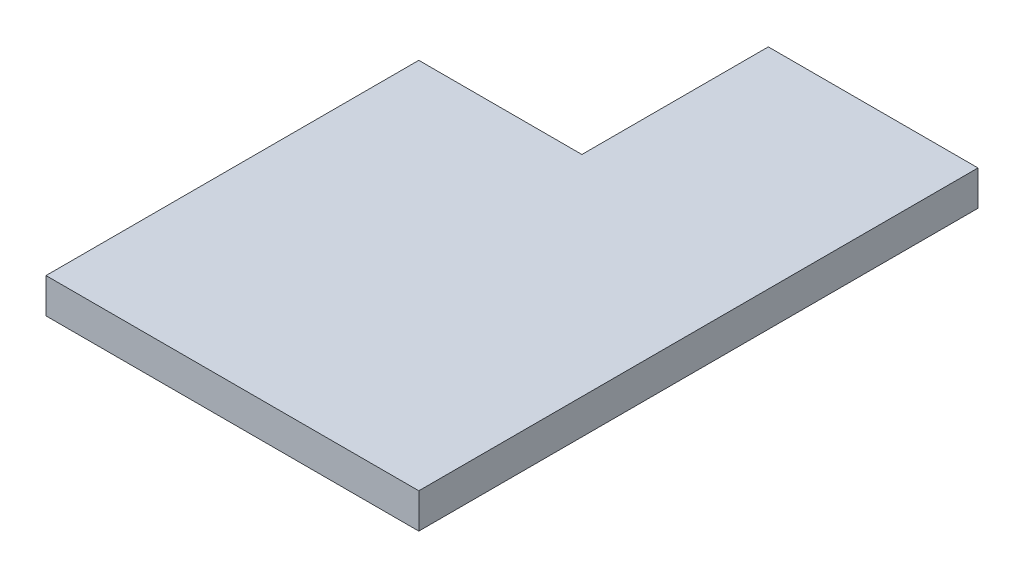
ISO-10303-21;
HEADER;
FILE_DESCRIPTION(('STEP AP214'),'2;1');
FILE_NAME('part.step','',(''),(''),'','','');
FILE_SCHEMA(('AUTOMOTIVE_DESIGN { 1 0 10303 214 1 1 1 1 }'));
ENDSEC;
DATA;
#1=APPLICATION_CONTEXT('core data for automotive mechanical design processes');
#2=APPLICATION_PROTOCOL_DEFINITION('international standard','automotive_design',2000,#1);
#3=PRODUCT_CONTEXT('',#1,'mechanical');
#4=PRODUCT('Part','Part','',(#3));
#5=PRODUCT_RELATED_PRODUCT_CATEGORY('part','',(#4));
#6=PRODUCT_DEFINITION_FORMATION('','',#4);
#7=PRODUCT_DEFINITION_CONTEXT('part definition',#1,'design');
#8=PRODUCT_DEFINITION('design','',#6,#7);
#9=PRODUCT_DEFINITION_SHAPE('','',#8);
#10=(LENGTH_UNIT() NAMED_UNIT(*) SI_UNIT(.MILLI.,.METRE.));
#11=(NAMED_UNIT(*) PLANE_ANGLE_UNIT() SI_UNIT($,.RADIAN.));
#12=(NAMED_UNIT(*) SI_UNIT($,.STERADIAN.) SOLID_ANGLE_UNIT());
#13=UNCERTAINTY_MEASURE_WITH_UNIT(LENGTH_MEASURE(1.E-05),#10,'distance_accuracy_value','');
#14=(GEOMETRIC_REPRESENTATION_CONTEXT(3) GLOBAL_UNCERTAINTY_ASSIGNED_CONTEXT((#13)) GLOBAL_UNIT_ASSIGNED_CONTEXT((#10,
#11,#12)) REPRESENTATION_CONTEXT('',''));
#15=CARTESIAN_POINT('',(0.,0.,0.));
#16=DIRECTION('',(0.,0.,1.));
#17=DIRECTION('',(1.,0.,0.));
#18=AXIS2_PLACEMENT_3D('',#15,#16,#17);
#19=CARTESIAN_POINT('',(0.,19.05,-203.2));
#20=DIRECTION('',(1.,0.,0.));
#21=DIRECTION('',(0.,0.,-1.));
#22=AXIS2_PLACEMENT_3D('',#19,#20,#21);
#23=PLANE('',#22);
#24=DIRECTION('',(0.,0.,1.));
#25=VECTOR('',#24,1.);
#26=CARTESIAN_POINT('',(0.,0.,-203.2));
#27=LINE('',#26,#25);
#28=CARTESIAN_POINT('',(0.,0.,-203.2));
#29=VERTEX_POINT('',#28);
#30=CARTESIAN_POINT('',(0.,0.,0.));
#31=VERTEX_POINT('',#30);
#32=EDGE_CURVE('E121',#29,#31,#27,.T.);
#33=ORIENTED_EDGE('',*,*,#32,.T.);
#34=DIRECTION('',(0.,-1.,0.));
#35=VECTOR('',#34,1.);
#36=CARTESIAN_POINT('',(0.,19.05,0.));
#37=LINE('',#36,#35);
#38=CARTESIAN_POINT('',(0.,19.05,0.));
#39=VERTEX_POINT('',#38);
#40=EDGE_CURVE('E11',#39,#31,#37,.T.);
#41=ORIENTED_EDGE('',*,*,#40,.F.);
#42=DIRECTION('',(0.,0.,1.));
#43=VECTOR('',#42,1.);
#44=CARTESIAN_POINT('',(0.,19.05,-203.2));
#45=LINE('',#44,#43);
#46=CARTESIAN_POINT('',(0.,19.05,-203.2));
#47=VERTEX_POINT('',#46);
#48=EDGE_CURVE('E133',#47,#39,#45,.T.);
#49=ORIENTED_EDGE('',*,*,#48,.F.);
#50=DIRECTION('',(0.,-1.,0.));
#51=VECTOR('',#50,1.);
#52=CARTESIAN_POINT('',(0.,19.05,-203.2));
#53=LINE('',#52,#51);
#54=EDGE_CURVE('E118',#47,#29,#53,.T.);
#55=ORIENTED_EDGE('',*,*,#54,.T.);
#56=EDGE_LOOP('',(#33,#41,#49,#55));
#57=FACE_BOUND('',#56,.T.);
#58=ADVANCED_FACE('F39',(#57),#23,.F.);
#59=CARTESIAN_POINT('',(0.,19.05,0.));
#60=DIRECTION('',(0.,0.,-1.));
#61=DIRECTION('',(-1.,0.,0.));
#62=AXIS2_PLACEMENT_3D('',#59,#60,#61);
#63=PLANE('',#62);
#64=DIRECTION('',(1.,0.,0.));
#65=VECTOR('',#64,1.);
#66=CARTESIAN_POINT('',(0.,0.,0.));
#67=LINE('',#66,#65);
#68=CARTESIAN_POINT('',(203.2,0.,0.));
#69=VERTEX_POINT('',#68);
#70=EDGE_CURVE('E128',#31,#69,#67,.T.);
#71=ORIENTED_EDGE('',*,*,#70,.T.);
#72=DIRECTION('',(0.,-1.,0.));
#73=VECTOR('',#72,1.);
#74=CARTESIAN_POINT('',(203.2,19.05,0.));
#75=LINE('',#74,#73);
#76=CARTESIAN_POINT('',(203.2,19.05,0.));
#77=VERTEX_POINT('',#76);
#78=EDGE_CURVE('E50',#77,#69,#75,.T.);
#79=ORIENTED_EDGE('',*,*,#78,.F.);
#80=DIRECTION('',(1.,0.,0.));
#81=VECTOR('',#80,1.);
#82=CARTESIAN_POINT('',(0.,19.05,0.));
#83=LINE('',#82,#81);
#84=EDGE_CURVE('E95',#39,#77,#83,.T.);
#85=ORIENTED_EDGE('',*,*,#84,.F.);
#86=ORIENTED_EDGE('',*,*,#40,.T.);
#87=EDGE_LOOP('',(#71,#79,#85,#86));
#88=FACE_BOUND('',#87,.T.);
#89=ADVANCED_FACE('F160',(#88),#63,.F.);
#90=CARTESIAN_POINT('',(203.2,19.05,0.));
#91=DIRECTION('',(-1.,0.,0.));
#92=DIRECTION('',(0.,0.,1.));
#93=AXIS2_PLACEMENT_3D('',#90,#91,#92);
#94=PLANE('',#93);
#95=DIRECTION('',(0.,0.,-1.));
#96=VECTOR('',#95,1.);
#97=CARTESIAN_POINT('',(203.2,0.,0.));
#98=LINE('',#97,#96);
#99=CARTESIAN_POINT('',(203.2,0.,-304.8));
#100=VERTEX_POINT('',#99);
#101=EDGE_CURVE('E126',#69,#100,#98,.T.);
#102=ORIENTED_EDGE('',*,*,#101,.T.);
#103=DIRECTION('',(0.,-1.,0.));
#104=VECTOR('',#103,1.);
#105=CARTESIAN_POINT('',(203.2,19.05,-304.8));
#106=LINE('',#105,#104);
#107=CARTESIAN_POINT('',(203.2,19.05,-304.8));
#108=VERTEX_POINT('',#107);
#109=EDGE_CURVE('E114',#108,#100,#106,.T.);
#110=ORIENTED_EDGE('',*,*,#109,.F.);
#111=DIRECTION('',(0.,0.,-1.));
#112=VECTOR('',#111,1.);
#113=CARTESIAN_POINT('',(203.2,19.05,0.));
#114=LINE('',#113,#112);
#115=EDGE_CURVE('E103',#77,#108,#114,.T.);
#116=ORIENTED_EDGE('',*,*,#115,.F.);
#117=ORIENTED_EDGE('',*,*,#78,.T.);
#118=EDGE_LOOP('',(#102,#110,#116,#117));
#119=FACE_BOUND('',#118,.T.);
#120=ADVANCED_FACE('F137',(#119),#94,.F.);
#121=CARTESIAN_POINT('',(203.2,19.05,-304.8));
#122=DIRECTION('',(0.,0.,1.));
#123=DIRECTION('',(1.,0.,0.));
#124=AXIS2_PLACEMENT_3D('',#121,#122,#123);
#125=PLANE('',#124);
#126=DIRECTION('',(-1.,0.,0.));
#127=VECTOR('',#126,1.);
#128=CARTESIAN_POINT('',(203.2,0.,-304.8));
#129=LINE('',#128,#127);
#130=CARTESIAN_POINT('',(88.9,0.,-304.8));
#131=VERTEX_POINT('',#130);
#132=EDGE_CURVE('E111',#100,#131,#129,.T.);
#133=ORIENTED_EDGE('',*,*,#132,.T.);
#134=DIRECTION('',(0.,-1.,0.));
#135=VECTOR('',#134,1.);
#136=CARTESIAN_POINT('',(88.9,19.05,-304.8));
#137=LINE('',#136,#135);
#138=CARTESIAN_POINT('',(88.9,19.05,-304.8));
#139=VERTEX_POINT('',#138);
#140=EDGE_CURVE('E110',#139,#131,#137,.T.);
#141=ORIENTED_EDGE('',*,*,#140,.F.);
#142=DIRECTION('',(-1.,0.,0.));
#143=VECTOR('',#142,1.);
#144=CARTESIAN_POINT('',(203.2,19.05,-304.8));
#145=LINE('',#144,#143);
#146=EDGE_CURVE('E98',#108,#139,#145,.T.);
#147=ORIENTED_EDGE('',*,*,#146,.F.);
#148=ORIENTED_EDGE('',*,*,#109,.T.);
#149=EDGE_LOOP('',(#133,#141,#147,#148));
#150=FACE_BOUND('',#149,.T.);
#151=ADVANCED_FACE('F112',(#150),#125,.F.);
#152=CARTESIAN_POINT('',(88.9,19.05,-304.8));
#153=DIRECTION('',(1.,0.,0.));
#154=DIRECTION('',(0.,0.,-1.));
#155=AXIS2_PLACEMENT_3D('',#152,#153,#154);
#156=PLANE('',#155);
#157=DIRECTION('',(0.,0.,1.));
#158=VECTOR('',#157,1.);
#159=CARTESIAN_POINT('',(88.9,0.,-304.8));
#160=LINE('',#159,#158);
#161=CARTESIAN_POINT('',(88.9,0.,-203.2));
#162=VERTEX_POINT('',#161);
#163=EDGE_CURVE('E76',#131,#162,#160,.T.);
#164=ORIENTED_EDGE('',*,*,#163,.T.);
#165=DIRECTION('',(0.,-1.,0.));
#166=VECTOR('',#165,1.);
#167=CARTESIAN_POINT('',(88.9,19.05,-203.2));
#168=LINE('',#167,#166);
#169=CARTESIAN_POINT('',(88.9,19.05,-203.2));
#170=VERTEX_POINT('',#169);
#171=EDGE_CURVE('E113',#170,#162,#168,.T.);
#172=ORIENTED_EDGE('',*,*,#171,.F.);
#173=DIRECTION('',(0.,0.,1.));
#174=VECTOR('',#173,1.);
#175=CARTESIAN_POINT('',(88.9,19.05,-304.8));
#176=LINE('',#175,#174);
#177=EDGE_CURVE('E104',#139,#170,#176,.T.);
#178=ORIENTED_EDGE('',*,*,#177,.F.);
#179=ORIENTED_EDGE('',*,*,#140,.T.);
#180=EDGE_LOOP('',(#164,#172,#178,#179));
#181=FACE_BOUND('',#180,.T.);
#182=ADVANCED_FACE('F117',(#181),#156,.F.);
#183=CARTESIAN_POINT('',(88.9,19.05,-203.2));
#184=DIRECTION('',(0.,0.,1.));
#185=DIRECTION('',(1.,0.,0.));
#186=AXIS2_PLACEMENT_3D('',#183,#184,#185);
#187=PLANE('',#186);
#188=DIRECTION('',(-1.,0.,0.));
#189=VECTOR('',#188,1.);
#190=CARTESIAN_POINT('',(88.9,0.,-203.2));
#191=LINE('',#190,#189);
#192=EDGE_CURVE('E84',#162,#29,#191,.T.);
#193=ORIENTED_EDGE('',*,*,#192,.T.);
#194=ORIENTED_EDGE('',*,*,#54,.F.);
#195=DIRECTION('',(-1.,0.,0.));
#196=VECTOR('',#195,1.);
#197=CARTESIAN_POINT('',(88.9,19.05,-203.2));
#198=LINE('',#197,#196);
#199=EDGE_CURVE('E54',#170,#47,#198,.T.);
#200=ORIENTED_EDGE('',*,*,#199,.F.);
#201=ORIENTED_EDGE('',*,*,#171,.T.);
#202=EDGE_LOOP('',(#193,#194,#200,#201));
#203=FACE_BOUND('',#202,.T.);
#204=ADVANCED_FACE('F147',(#203),#187,.F.);
#205=CARTESIAN_POINT('',(0.,19.05,0.));
#206=DIRECTION('',(0.,1.,0.));
#207=DIRECTION('',(0.,0.,1.));
#208=AXIS2_PLACEMENT_3D('',#205,#206,#207);
#209=PLANE('',#208);
#210=ORIENTED_EDGE('',*,*,#48,.T.);
#211=ORIENTED_EDGE('',*,*,#84,.T.);
#212=ORIENTED_EDGE('',*,*,#115,.T.);
#213=ORIENTED_EDGE('',*,*,#146,.T.);
#214=ORIENTED_EDGE('',*,*,#177,.T.);
#215=ORIENTED_EDGE('',*,*,#199,.T.);
#216=EDGE_LOOP('',(#210,#211,#212,#213,#214,#215));
#217=FACE_BOUND('',#216,.T.);
#218=ADVANCED_FACE('F102',(#217),#209,.T.);
#219=CARTESIAN_POINT('',(0.,0.,0.));
#220=DIRECTION('',(0.,1.,0.));
#221=DIRECTION('',(0.,0.,1.));
#222=AXIS2_PLACEMENT_3D('',#219,#220,#221);
#223=PLANE('',#222);
#224=ORIENTED_EDGE('',*,*,#32,.F.);
#225=ORIENTED_EDGE('',*,*,#192,.F.);
#226=ORIENTED_EDGE('',*,*,#163,.F.);
#227=ORIENTED_EDGE('',*,*,#132,.F.);
#228=ORIENTED_EDGE('',*,*,#101,.F.);
#229=ORIENTED_EDGE('',*,*,#70,.F.);
#230=EDGE_LOOP('',(#224,#225,#226,#227,#228,#229));
#231=FACE_BOUND('',#230,.T.);
#232=ADVANCED_FACE('F145',(#231),#223,.F.);
#233=CLOSED_SHELL('',(#58,#89,#120,#151,#182,#204,#218,#232));
#234=MANIFOLD_SOLID_BREP('B2',#233);
#235=ADVANCED_BREP_SHAPE_REPRESENTATION('',(#18,#234),#14);
#236=SHAPE_DEFINITION_REPRESENTATION(#9,#235);
ENDSEC;
END-ISO-10303-21;
